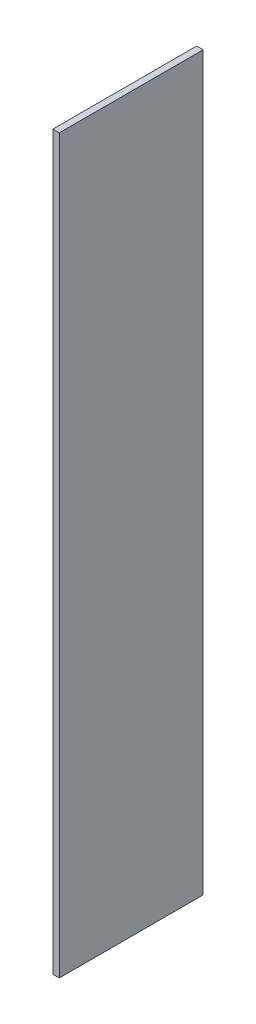
ISO-10303-21;
HEADER;
FILE_DESCRIPTION(('STEP AP214'),'2;1');
FILE_NAME('part.step','',(''),(''),'','','');
FILE_SCHEMA(('AUTOMOTIVE_DESIGN { 1 0 10303 214 1 1 1 1 }'));
ENDSEC;
DATA;
#1=APPLICATION_CONTEXT('core data for automotive mechanical design processes');
#2=APPLICATION_PROTOCOL_DEFINITION('international standard','automotive_design',2000,#1);
#3=PRODUCT_CONTEXT('',#1,'mechanical');
#4=PRODUCT('Part','Part','',(#3));
#5=PRODUCT_RELATED_PRODUCT_CATEGORY('part','',(#4));
#6=PRODUCT_DEFINITION_FORMATION('','',#4);
#7=PRODUCT_DEFINITION_CONTEXT('part definition',#1,'design');
#8=PRODUCT_DEFINITION('design','',#6,#7);
#9=PRODUCT_DEFINITION_SHAPE('','',#8);
#10=(LENGTH_UNIT() NAMED_UNIT(*) SI_UNIT(.MILLI.,.METRE.));
#11=(NAMED_UNIT(*) PLANE_ANGLE_UNIT() SI_UNIT($,.RADIAN.));
#12=(NAMED_UNIT(*) SI_UNIT($,.STERADIAN.) SOLID_ANGLE_UNIT());
#13=UNCERTAINTY_MEASURE_WITH_UNIT(LENGTH_MEASURE(1.E-05),#10,'distance_accuracy_value','');
#14=(GEOMETRIC_REPRESENTATION_CONTEXT(3) GLOBAL_UNCERTAINTY_ASSIGNED_CONTEXT((#13)) GLOBAL_UNIT_ASSIGNED_CONTEXT((#10,
#11,#12)) REPRESENTATION_CONTEXT('',''));
#15=CARTESIAN_POINT('',(0.,0.,0.));
#16=DIRECTION('',(0.,0.,1.));
#17=DIRECTION('',(1.,0.,0.));
#18=AXIS2_PLACEMENT_3D('',#15,#16,#17);
#19=CARTESIAN_POINT('',(2.54,143.51,-28.2194));
#20=DIRECTION('',(0.,0.,1.));
#21=DIRECTION('',(0.,-1.,0.));
#22=AXIS2_PLACEMENT_3D('',#19,#20,#21);
#23=PLANE('',#22);
#24=DIRECTION('',(0.,1.,0.));
#25=VECTOR('',#24,1.);
#26=CARTESIAN_POINT('',(0.,143.51,-28.2194));
#27=LINE('',#26,#25);
#28=CARTESIAN_POINT('',(0.,-143.51,-28.2194));
#29=VERTEX_POINT('',#28);
#30=CARTESIAN_POINT('',(0.,143.51,-28.2194));
#31=VERTEX_POINT('',#30);
#32=EDGE_CURVE('E96',#29,#31,#27,.T.);
#33=ORIENTED_EDGE('',*,*,#32,.T.);
#34=DIRECTION('',(-1.,0.,0.));
#35=VECTOR('',#34,1.);
#36=CARTESIAN_POINT('',(2.54,143.51,-28.2194));
#37=LINE('',#36,#35);
#38=CARTESIAN_POINT('',(2.54,143.51,-28.2194));
#39=VERTEX_POINT('',#38);
#40=EDGE_CURVE('E11',#39,#31,#37,.T.);
#41=ORIENTED_EDGE('',*,*,#40,.F.);
#42=DIRECTION('',(0.,1.,0.));
#43=VECTOR('',#42,1.);
#44=CARTESIAN_POINT('',(2.54,143.51,-28.2194));
#45=LINE('',#44,#43);
#46=CARTESIAN_POINT('',(2.54,-143.51,-28.2194));
#47=VERTEX_POINT('',#46);
#48=EDGE_CURVE('E84',#47,#39,#45,.T.);
#49=ORIENTED_EDGE('',*,*,#48,.F.);
#50=DIRECTION('',(-1.,0.,0.));
#51=VECTOR('',#50,1.);
#52=CARTESIAN_POINT('',(2.54,-143.51,-28.2194));
#53=LINE('',#52,#51);
#54=EDGE_CURVE('E92',#47,#29,#53,.T.);
#55=ORIENTED_EDGE('',*,*,#54,.T.);
#56=EDGE_LOOP('',(#33,#41,#49,#55));
#57=FACE_BOUND('',#56,.T.);
#58=ADVANCED_FACE('F33',(#57),#23,.F.);
#59=CARTESIAN_POINT('',(2.54,143.51,28.2194));
#60=DIRECTION('',(0.,-1.,0.));
#61=DIRECTION('',(0.,0.,-1.));
#62=AXIS2_PLACEMENT_3D('',#59,#60,#61);
#63=PLANE('',#62);
#64=DIRECTION('',(0.,0.,1.));
#65=VECTOR('',#64,1.);
#66=CARTESIAN_POINT('',(0.,143.51,28.2194));
#67=LINE('',#66,#65);
#68=CARTESIAN_POINT('',(0.,143.51,28.2194));
#69=VERTEX_POINT('',#68);
#70=EDGE_CURVE('E88',#31,#69,#67,.T.);
#71=ORIENTED_EDGE('',*,*,#70,.T.);
#72=DIRECTION('',(-1.,0.,0.));
#73=VECTOR('',#72,1.);
#74=CARTESIAN_POINT('',(2.54,143.51,28.2194));
#75=LINE('',#74,#73);
#76=CARTESIAN_POINT('',(2.54,143.51,28.2194));
#77=VERTEX_POINT('',#76);
#78=EDGE_CURVE('E41',#77,#69,#75,.T.);
#79=ORIENTED_EDGE('',*,*,#78,.F.);
#80=DIRECTION('',(0.,0.,1.));
#81=VECTOR('',#80,1.);
#82=CARTESIAN_POINT('',(2.54,143.51,28.2194));
#83=LINE('',#82,#81);
#84=EDGE_CURVE('E79',#39,#77,#83,.T.);
#85=ORIENTED_EDGE('',*,*,#84,.F.);
#86=ORIENTED_EDGE('',*,*,#40,.T.);
#87=EDGE_LOOP('',(#71,#79,#85,#86));
#88=FACE_BOUND('',#87,.T.);
#89=ADVANCED_FACE('F87',(#88),#63,.F.);
#90=CARTESIAN_POINT('',(2.54,143.51,28.2194));
#91=DIRECTION('',(0.,0.,-1.));
#92=DIRECTION('',(0.,1.,0.));
#93=AXIS2_PLACEMENT_3D('',#90,#91,#92);
#94=PLANE('',#93);
#95=DIRECTION('',(0.,-1.,0.));
#96=VECTOR('',#95,1.);
#97=CARTESIAN_POINT('',(0.,143.51,28.2194));
#98=LINE('',#97,#96);
#99=CARTESIAN_POINT('',(0.,-143.51,28.2194));
#100=VERTEX_POINT('',#99);
#101=EDGE_CURVE('E66',#69,#100,#98,.T.);
#102=ORIENTED_EDGE('',*,*,#101,.T.);
#103=DIRECTION('',(-1.,0.,0.));
#104=VECTOR('',#103,1.);
#105=CARTESIAN_POINT('',(2.54,-143.51,28.2194));
#106=LINE('',#105,#104);
#107=CARTESIAN_POINT('',(2.54,-143.51,28.2194));
#108=VERTEX_POINT('',#107);
#109=EDGE_CURVE('E89',#108,#100,#106,.T.);
#110=ORIENTED_EDGE('',*,*,#109,.F.);
#111=DIRECTION('',(0.,-1.,0.));
#112=VECTOR('',#111,1.);
#113=CARTESIAN_POINT('',(2.54,143.51,28.2194));
#114=LINE('',#113,#112);
#115=EDGE_CURVE('E82',#77,#108,#114,.T.);
#116=ORIENTED_EDGE('',*,*,#115,.F.);
#117=ORIENTED_EDGE('',*,*,#78,.T.);
#118=EDGE_LOOP('',(#102,#110,#116,#117));
#119=FACE_BOUND('',#118,.T.);
#120=ADVANCED_FACE('F90',(#119),#94,.F.);
#121=CARTESIAN_POINT('',(2.54,-143.51,28.2194));
#122=DIRECTION('',(0.,1.,0.));
#123=DIRECTION('',(0.,0.,1.));
#124=AXIS2_PLACEMENT_3D('',#121,#122,#123);
#125=PLANE('',#124);
#126=DIRECTION('',(0.,0.,-1.));
#127=VECTOR('',#126,1.);
#128=CARTESIAN_POINT('',(0.,-143.51,28.2194));
#129=LINE('',#128,#127);
#130=EDGE_CURVE('E72',#100,#29,#129,.T.);
#131=ORIENTED_EDGE('',*,*,#130,.T.);
#132=ORIENTED_EDGE('',*,*,#54,.F.);
#133=DIRECTION('',(0.,0.,-1.));
#134=VECTOR('',#133,1.);
#135=CARTESIAN_POINT('',(2.54,-143.51,28.2194));
#136=LINE('',#135,#134);
#137=EDGE_CURVE('E49',#108,#47,#136,.T.);
#138=ORIENTED_EDGE('',*,*,#137,.F.);
#139=ORIENTED_EDGE('',*,*,#109,.T.);
#140=EDGE_LOOP('',(#131,#132,#138,#139));
#141=FACE_BOUND('',#140,.T.);
#142=ADVANCED_FACE('F103',(#141),#125,.F.);
#143=CARTESIAN_POINT('',(2.54,0.,0.));
#144=DIRECTION('',(1.,0.,0.));
#145=DIRECTION('',(0.,0.,-1.));
#146=AXIS2_PLACEMENT_3D('',#143,#144,#145);
#147=PLANE('',#146);
#148=ORIENTED_EDGE('',*,*,#48,.T.);
#149=ORIENTED_EDGE('',*,*,#84,.T.);
#150=ORIENTED_EDGE('',*,*,#115,.T.);
#151=ORIENTED_EDGE('',*,*,#137,.T.);
#152=EDGE_LOOP('',(#148,#149,#150,#151));
#153=FACE_BOUND('',#152,.T.);
#154=ADVANCED_FACE('F80',(#153),#147,.T.);
#155=CARTESIAN_POINT('',(0.,0.,0.));
#156=DIRECTION('',(1.,0.,0.));
#157=DIRECTION('',(0.,0.,-1.));
#158=AXIS2_PLACEMENT_3D('',#155,#156,#157);
#159=PLANE('',#158);
#160=ORIENTED_EDGE('',*,*,#32,.F.);
#161=ORIENTED_EDGE('',*,*,#130,.F.);
#162=ORIENTED_EDGE('',*,*,#101,.F.);
#163=ORIENTED_EDGE('',*,*,#70,.F.);
#164=EDGE_LOOP('',(#160,#161,#162,#163));
#165=FACE_BOUND('',#164,.T.);
#166=ADVANCED_FACE('F106',(#165),#159,.F.);
#167=CLOSED_SHELL('',(#58,#89,#120,#142,#154,#166));
#168=MANIFOLD_SOLID_BREP('B2',#167);
#169=ADVANCED_BREP_SHAPE_REPRESENTATION('',(#18,#168),#14);
#170=SHAPE_DEFINITION_REPRESENTATION(#9,#169);
ENDSEC;
END-ISO-10303-21;
